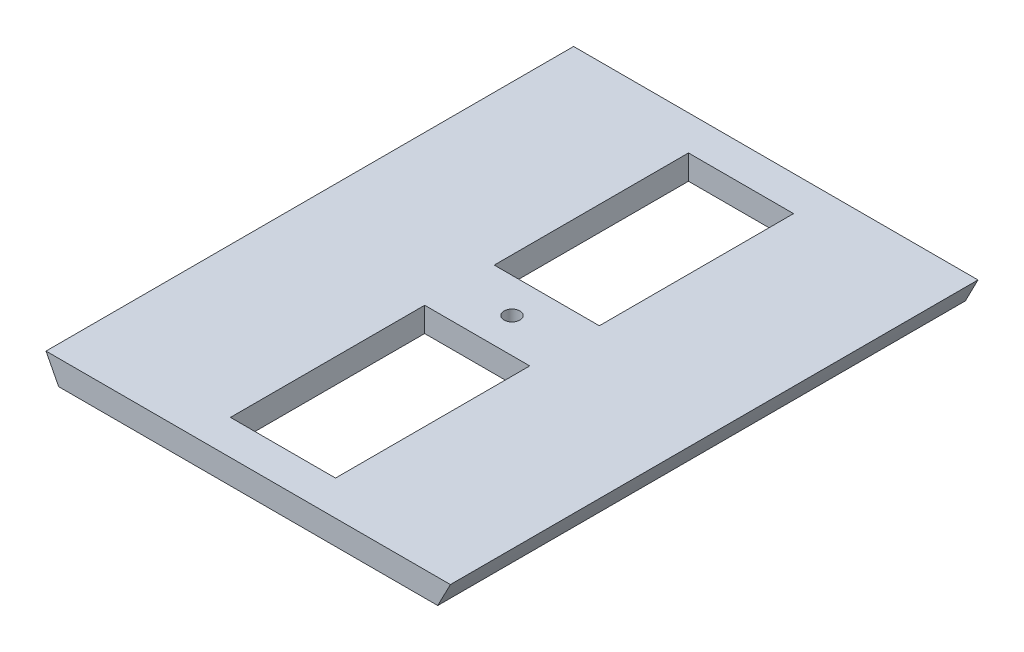
ISO-10303-21;
HEADER;
FILE_DESCRIPTION(('STEP AP214'),'2;1');
FILE_NAME('part.step','',(''),(''),'','','');
FILE_SCHEMA(('AUTOMOTIVE_DESIGN { 1 0 10303 214 1 1 1 1 }'));
ENDSEC;
DATA;
#1=APPLICATION_CONTEXT('core data for automotive mechanical design processes');
#2=APPLICATION_PROTOCOL_DEFINITION('international standard','automotive_design',2000,#1);
#3=PRODUCT_CONTEXT('',#1,'mechanical');
#4=PRODUCT('Part','Part','',(#3));
#5=PRODUCT_RELATED_PRODUCT_CATEGORY('part','',(#4));
#6=PRODUCT_DEFINITION_FORMATION('','',#4);
#7=PRODUCT_DEFINITION_CONTEXT('part definition',#1,'design');
#8=PRODUCT_DEFINITION('design','',#6,#7);
#9=PRODUCT_DEFINITION_SHAPE('','',#8);
#10=(LENGTH_UNIT() NAMED_UNIT(*) SI_UNIT(.MILLI.,.METRE.));
#11=(NAMED_UNIT(*) PLANE_ANGLE_UNIT() SI_UNIT($,.RADIAN.));
#12=(NAMED_UNIT(*) SI_UNIT($,.STERADIAN.) SOLID_ANGLE_UNIT());
#13=UNCERTAINTY_MEASURE_WITH_UNIT(LENGTH_MEASURE(1.E-05),#10,'distance_accuracy_value','');
#14=(GEOMETRIC_REPRESENTATION_CONTEXT(3) GLOBAL_UNCERTAINTY_ASSIGNED_CONTEXT((#13)) GLOBAL_UNIT_ASSIGNED_CONTEXT((#10,
#11,#12)) REPRESENTATION_CONTEXT('',''));
#15=CARTESIAN_POINT('',(0.,0.,0.));
#16=DIRECTION('',(0.,0.,1.));
#17=DIRECTION('',(1.,0.,0.));
#18=AXIS2_PLACEMENT_3D('',#15,#16,#17);
#19=CARTESIAN_POINT('',(-127.000000000214,127.000000000428,331.382));
#20=CARTESIAN_POINT('',(-3.79340656109228E-11,-127.000000000353,331.382));
#21=CARTESIAN_POINT('',(127.000000000138,127.000000000277,331.382));
#22=B_SPLINE_CURVE_WITH_KNOTS('',2,(#19,#20,#21),.UNSPECIFIED.,.F.,.F.,(3,3),
(0.0560283962320779,0.943971603767657),.UNSPECIFIED.);
#23=DIRECTION('',(0.,0.,-1.));
#24=VECTOR('',#23,1.);
#25=SURFACE_OF_LINEAR_EXTRUSION('',#22,#24);
#26=CARTESIAN_POINT('',(-127.000000000214,127.000000000428,0.));
#27=CARTESIAN_POINT('',(-3.79340656109228E-11,-127.000000000353,0.));
#28=CARTESIAN_POINT('',(127.000000000138,127.000000000277,0.));
#29=B_SPLINE_CURVE_WITH_KNOTS('',2,(#26,#27,#28),.UNSPECIFIED.,.F.,.F.,(3,3),
(0.0560283962320779,0.943971603767657),.UNSPECIFIED.);
#30=CARTESIAN_POINT('',(-127.000000000171,127.000000000343,0.));
#31=VERTEX_POINT('',#30);
#32=CARTESIAN_POINT('',(-119.051249468448,111.599999999989,0.));
#33=VERTEX_POINT('',#32);
#34=EDGE_CURVE('E141',#31,#33,#29,.T.);
#35=ORIENTED_EDGE('',*,*,#34,.T.);
#36=DIRECTION('',(0.,0.,-1.));
#37=VECTOR('',#36,1.);
#38=CARTESIAN_POINT('',(-119.051249468454,111.6,331.382));
#39=LINE('',#38,#37);
#40=CARTESIAN_POINT('',(-119.051249468448,111.6,331.382));
#41=VERTEX_POINT('',#40);
#42=EDGE_CURVE('E50',#33,#41,#39,.F.);
#43=ORIENTED_EDGE('',*,*,#42,.T.);
#44=CARTESIAN_POINT('',(-127.000000000171,127.000000000343,331.382));
#45=VERTEX_POINT('',#44);
#46=EDGE_CURVE('E159',#45,#41,#22,.T.);
#47=ORIENTED_EDGE('',*,*,#46,.F.);
#48=DIRECTION('',(0.,0.,-1.));
#49=VECTOR('',#48,1.);
#50=CARTESIAN_POINT('',(-127.000000000171,127.000000000343,331.382));
#51=LINE('',#50,#49);
#52=EDGE_CURVE('E43',#45,#31,#51,.T.);
#53=ORIENTED_EDGE('',*,*,#52,.T.);
#54=EDGE_LOOP('',(#35,#43,#47,#53));
#55=FACE_BOUND('',#54,.T.);
#56=ADVANCED_FACE('F33',(#55),#25,.F.);
#57=CARTESIAN_POINT('',(119.051249468448,111.6,331.382));
#58=VERTEX_POINT('',#57);
#59=CARTESIAN_POINT('',(127.000000000094,127.000000000343,331.382));
#60=VERTEX_POINT('',#59);
#61=EDGE_CURVE('E137',#58,#60,#22,.T.);
#62=ORIENTED_EDGE('',*,*,#61,.F.);
#63=DIRECTION('',(0.,0.,-1.));
#64=VECTOR('',#63,1.);
#65=CARTESIAN_POINT('',(119.051249468454,111.6,331.382));
#66=LINE('',#65,#64);
#67=CARTESIAN_POINT('',(119.051249468448,111.6,0.));
#68=VERTEX_POINT('',#67);
#69=EDGE_CURVE('E124',#58,#68,#66,.T.);
#70=ORIENTED_EDGE('',*,*,#69,.T.);
#71=CARTESIAN_POINT('',(127.000000000094,127.000000000343,0.));
#72=VERTEX_POINT('',#71);
#73=EDGE_CURVE('E135',#68,#72,#29,.T.);
#74=ORIENTED_EDGE('',*,*,#73,.T.);
#75=DIRECTION('',(0.,0.,-1.));
#76=VECTOR('',#75,1.);
#77=CARTESIAN_POINT('',(127.000000000094,127.000000000343,331.382));
#78=LINE('',#77,#76);
#79=EDGE_CURVE('E11',#60,#72,#78,.T.);
#80=ORIENTED_EDGE('',*,*,#79,.F.);
#81=EDGE_LOOP('',(#62,#70,#74,#80));
#82=FACE_BOUND('',#81,.T.);
#83=ADVANCED_FACE('F35',(#82),#25,.F.);
#84=CARTESIAN_POINT('',(-127.000000000171,127.000000000343,331.382));
#85=DIRECTION('',(0.,-1.,0.));
#86=DIRECTION('',(0.,0.,-1.));
#87=AXIS2_PLACEMENT_3D('',#84,#85,#86);
#88=PLANE('',#87);
#89=CARTESIAN_POINT('',(-3.86635168325711E-11,127.000000000343,165.691));
#90=DIRECTION('',(0.,1.,0.));
#91=DIRECTION('',(0.,0.,1.));
#92=AXIS2_PLACEMENT_3D('',#89,#90,#91);
#93=CIRCLE('',#92,5.);
#94=CARTESIAN_POINT('',(-3.86635168325711E-11,127.000000000343,170.691));
#95=VERTEX_POINT('',#94);
#96=EDGE_CURVE('E207',#95,#95,#93,.T.);
#97=ORIENTED_EDGE('',*,*,#96,.F.);
#98=EDGE_LOOP('',(#97));
#99=FACE_BOUND('',#98,.T.);
#100=DIRECTION('',(1.,0.,0.));
#101=VECTOR('',#100,1.);
#102=CARTESIAN_POINT('',(-33.,127.000000000343,309.5365));
#103=LINE('',#102,#101);
#104=CARTESIAN_POINT('',(-33.,127.000000000343,309.5365));
#105=VERTEX_POINT('',#104);
#106=CARTESIAN_POINT('',(33.,127.000000000343,309.5365));
#107=VERTEX_POINT('',#106);
#108=EDGE_CURVE('E201',#105,#107,#103,.T.);
#109=ORIENTED_EDGE('',*,*,#108,.F.);
#110=DIRECTION('',(0.,0.,1.));
#111=VECTOR('',#110,1.);
#112=CARTESIAN_POINT('',(-33.,127.000000000343,187.5365));
#113=LINE('',#112,#111);
#114=CARTESIAN_POINT('',(-33.,127.000000000343,187.5365));
#115=VERTEX_POINT('',#114);
#116=EDGE_CURVE('E204',#115,#105,#113,.T.);
#117=ORIENTED_EDGE('',*,*,#116,.F.);
#118=DIRECTION('',(-1.,0.,0.));
#119=VECTOR('',#118,1.);
#120=CARTESIAN_POINT('',(-33.,127.000000000343,187.5365));
#121=LINE('',#120,#119);
#122=CARTESIAN_POINT('',(33.,127.000000000343,187.5365));
#123=VERTEX_POINT('',#122);
#124=EDGE_CURVE('E191',#123,#115,#121,.T.);
#125=ORIENTED_EDGE('',*,*,#124,.F.);
#126=DIRECTION('',(0.,0.,-1.));
#127=VECTOR('',#126,1.);
#128=CARTESIAN_POINT('',(33.,127.000000000343,187.5365));
#129=LINE('',#128,#127);
#130=EDGE_CURVE('E198',#107,#123,#129,.T.);
#131=ORIENTED_EDGE('',*,*,#130,.F.);
#132=EDGE_LOOP('',(#109,#117,#125,#131));
#133=FACE_BOUND('',#132,.T.);
#134=DIRECTION('',(1.,0.,0.));
#135=VECTOR('',#134,1.);
#136=CARTESIAN_POINT('',(-33.,127.000000000343,143.8455));
#137=LINE('',#136,#135);
#138=CARTESIAN_POINT('',(-33.,127.000000000343,143.8455));
#139=VERTEX_POINT('',#138);
#140=CARTESIAN_POINT('',(33.,127.000000000343,143.8455));
#141=VERTEX_POINT('',#140);
#142=EDGE_CURVE('E181',#139,#141,#137,.T.);
#143=ORIENTED_EDGE('',*,*,#142,.F.);
#144=DIRECTION('',(0.,0.,1.));
#145=VECTOR('',#144,1.);
#146=CARTESIAN_POINT('',(-33.,127.000000000343,21.8455));
#147=LINE('',#146,#145);
#148=CARTESIAN_POINT('',(-33.,127.000000000343,21.8455));
#149=VERTEX_POINT('',#148);
#150=EDGE_CURVE('E184',#149,#139,#147,.T.);
#151=ORIENTED_EDGE('',*,*,#150,.F.);
#152=DIRECTION('',(-1.,0.,0.));
#153=VECTOR('',#152,1.);
#154=CARTESIAN_POINT('',(-33.,127.000000000343,21.8455));
#155=LINE('',#154,#153);
#156=CARTESIAN_POINT('',(33.,127.000000000343,21.8455));
#157=VERTEX_POINT('',#156);
#158=EDGE_CURVE('E173',#157,#149,#155,.T.);
#159=ORIENTED_EDGE('',*,*,#158,.F.);
#160=DIRECTION('',(0.,0.,-1.));
#161=VECTOR('',#160,1.);
#162=CARTESIAN_POINT('',(33.,127.000000000343,21.8455));
#163=LINE('',#162,#161);
#164=EDGE_CURVE('E178',#141,#157,#163,.T.);
#165=ORIENTED_EDGE('',*,*,#164,.F.);
#166=EDGE_LOOP('',(#143,#151,#159,#165));
#167=FACE_BOUND('',#166,.T.);
#168=DIRECTION('',(-1.,0.,0.));
#169=VECTOR('',#168,1.);
#170=CARTESIAN_POINT('',(-127.000000000171,127.000000000343,0.));
#171=LINE('',#170,#169);
#172=EDGE_CURVE('E140',#72,#31,#171,.T.);
#173=ORIENTED_EDGE('',*,*,#172,.T.);
#174=ORIENTED_EDGE('',*,*,#52,.F.);
#175=DIRECTION('',(-1.,0.,0.));
#176=VECTOR('',#175,1.);
#177=CARTESIAN_POINT('',(-127.000000000171,127.000000000343,331.382));
#178=LINE('',#177,#176);
#179=EDGE_CURVE('E150',#60,#45,#178,.T.);
#180=ORIENTED_EDGE('',*,*,#179,.F.);
#181=ORIENTED_EDGE('',*,*,#79,.T.);
#182=EDGE_LOOP('',(#173,#174,#180,#181));
#183=FACE_BOUND('',#182,.T.);
#184=ADVANCED_FACE('F253',(#99,#133,#167,#183),#88,.F.);
#185=CARTESIAN_POINT('',(-3.79349329726608E-11,0.,331.382));
#186=DIRECTION('',(0.,0.,-1.));
#187=DIRECTION('',(-1.,0.,0.));
#188=AXIS2_PLACEMENT_3D('',#185,#186,#187);
#189=PLANE('',#188);
#190=ORIENTED_EDGE('',*,*,#46,.T.);
#191=DIRECTION('',(1.,0.,0.));
#192=VECTOR('',#191,1.);
#193=CARTESIAN_POINT('',(120.,111.6,331.382));
#194=LINE('',#193,#192);
#195=EDGE_CURVE('E130',#41,#58,#194,.T.);
#196=ORIENTED_EDGE('',*,*,#195,.T.);
#197=ORIENTED_EDGE('',*,*,#61,.T.);
#198=ORIENTED_EDGE('',*,*,#179,.T.);
#199=EDGE_LOOP('',(#190,#196,#197,#198));
#200=FACE_BOUND('',#199,.T.);
#201=ADVANCED_FACE('F267',(#200),#189,.F.);
#202=CARTESIAN_POINT('',(-3.79349329726608E-11,0.,0.));
#203=DIRECTION('',(0.,0.,-1.));
#204=DIRECTION('',(-1.,0.,0.));
#205=AXIS2_PLACEMENT_3D('',#202,#203,#204);
#206=PLANE('',#205);
#207=DIRECTION('',(1.,0.,0.));
#208=VECTOR('',#207,1.);
#209=CARTESIAN_POINT('',(120.,111.6,0.));
#210=LINE('',#209,#208);
#211=EDGE_CURVE('E121',#33,#68,#210,.T.);
#212=ORIENTED_EDGE('',*,*,#211,.F.);
#213=ORIENTED_EDGE('',*,*,#34,.F.);
#214=ORIENTED_EDGE('',*,*,#172,.F.);
#215=ORIENTED_EDGE('',*,*,#73,.F.);
#216=EDGE_LOOP('',(#212,#213,#214,#215));
#217=FACE_BOUND('',#216,.T.);
#218=ADVANCED_FACE('F139',(#217),#206,.T.);
#219=CARTESIAN_POINT('',(-33.,-3.79141162909491E-11,21.8455));
#220=DIRECTION('',(-1.,0.,0.));
#221=DIRECTION('',(0.,0.,1.));
#222=AXIS2_PLACEMENT_3D('',#219,#220,#221);
#223=PLANE('',#222);
#224=DIRECTION('',(0.,1.,0.));
#225=VECTOR('',#224,1.);
#226=CARTESIAN_POINT('',(-33.,-3.79141162909491E-11,143.8455));
#227=LINE('',#226,#225);
#228=CARTESIAN_POINT('',(-33.,111.6,143.8455));
#229=VERTEX_POINT('',#228);
#230=EDGE_CURVE('E167',#229,#139,#227,.T.);
#231=ORIENTED_EDGE('',*,*,#230,.F.);
#232=DIRECTION('',(0.,0.,-1.));
#233=VECTOR('',#232,1.);
#234=CARTESIAN_POINT('',(-33.,111.6,21.8455));
#235=LINE('',#234,#233);
#236=CARTESIAN_POINT('',(-33.,111.6,21.8455));
#237=VERTEX_POINT('',#236);
#238=EDGE_CURVE('E58',#229,#237,#235,.T.);
#239=ORIENTED_EDGE('',*,*,#238,.T.);
#240=DIRECTION('',(0.,1.,0.));
#241=VECTOR('',#240,1.);
#242=CARTESIAN_POINT('',(-33.,-3.79141162909491E-11,21.8455));
#243=LINE('',#242,#241);
#244=EDGE_CURVE('E142',#237,#149,#243,.T.);
#245=ORIENTED_EDGE('',*,*,#244,.T.);
#246=ORIENTED_EDGE('',*,*,#150,.T.);
#247=EDGE_LOOP('',(#231,#239,#245,#246));
#248=FACE_BOUND('',#247,.T.);
#249=ADVANCED_FACE('F259',(#248),#223,.F.);
#250=CARTESIAN_POINT('',(-33.,-3.79141162909491E-11,21.8455));
#251=DIRECTION('',(0.,0.,-1.));
#252=DIRECTION('',(-1.,0.,0.));
#253=AXIS2_PLACEMENT_3D('',#250,#251,#252);
#254=PLANE('',#253);
#255=ORIENTED_EDGE('',*,*,#244,.F.);
#256=DIRECTION('',(1.,0.,0.));
#257=VECTOR('',#256,1.);
#258=CARTESIAN_POINT('',(-33.,111.6,21.8455));
#259=LINE('',#258,#257);
#260=CARTESIAN_POINT('',(33.,111.6,21.8455));
#261=VERTEX_POINT('',#260);
#262=EDGE_CURVE('E212',#237,#261,#259,.T.);
#263=ORIENTED_EDGE('',*,*,#262,.T.);
#264=DIRECTION('',(0.,1.,0.));
#265=VECTOR('',#264,1.);
#266=CARTESIAN_POINT('',(33.,-3.79141162909491E-11,21.8455));
#267=LINE('',#266,#265);
#268=EDGE_CURVE('E144',#261,#157,#267,.T.);
#269=ORIENTED_EDGE('',*,*,#268,.T.);
#270=ORIENTED_EDGE('',*,*,#158,.T.);
#271=EDGE_LOOP('',(#255,#263,#269,#270));
#272=FACE_BOUND('',#271,.T.);
#273=ADVANCED_FACE('F257',(#272),#254,.F.);
#274=CARTESIAN_POINT('',(33.,-3.79141162909491E-11,21.8455));
#275=DIRECTION('',(1.,0.,0.));
#276=DIRECTION('',(0.,0.,-1.));
#277=AXIS2_PLACEMENT_3D('',#274,#275,#276);
#278=PLANE('',#277);
#279=ORIENTED_EDGE('',*,*,#268,.F.);
#280=DIRECTION('',(0.,0.,1.));
#281=VECTOR('',#280,1.);
#282=CARTESIAN_POINT('',(33.,111.6,21.8455));
#283=LINE('',#282,#281);
#284=CARTESIAN_POINT('',(33.0000000000001,111.6,143.8455));
#285=VERTEX_POINT('',#284);
#286=EDGE_CURVE('E215',#261,#285,#283,.T.);
#287=ORIENTED_EDGE('',*,*,#286,.T.);
#288=DIRECTION('',(0.,1.,0.));
#289=VECTOR('',#288,1.);
#290=CARTESIAN_POINT('',(33.,-3.79141162909491E-11,143.8455));
#291=LINE('',#290,#289);
#292=EDGE_CURVE('E172',#285,#141,#291,.T.);
#293=ORIENTED_EDGE('',*,*,#292,.T.);
#294=ORIENTED_EDGE('',*,*,#164,.T.);
#295=EDGE_LOOP('',(#279,#287,#293,#294));
#296=FACE_BOUND('',#295,.T.);
#297=ADVANCED_FACE('F246',(#296),#278,.F.);
#298=CARTESIAN_POINT('',(-33.,-3.79141162909491E-11,143.8455));
#299=DIRECTION('',(0.,0.,1.));
#300=DIRECTION('',(1.,0.,0.));
#301=AXIS2_PLACEMENT_3D('',#298,#299,#300);
#302=PLANE('',#301);
#303=ORIENTED_EDGE('',*,*,#292,.F.);
#304=DIRECTION('',(-1.,0.,0.));
#305=VECTOR('',#304,1.);
#306=CARTESIAN_POINT('',(-33.,111.6,143.8455));
#307=LINE('',#306,#305);
#308=EDGE_CURVE('E218',#285,#229,#307,.T.);
#309=ORIENTED_EDGE('',*,*,#308,.T.);
#310=ORIENTED_EDGE('',*,*,#230,.T.);
#311=ORIENTED_EDGE('',*,*,#142,.T.);
#312=EDGE_LOOP('',(#303,#309,#310,#311));
#313=FACE_BOUND('',#312,.T.);
#314=ADVANCED_FACE('F247',(#313),#302,.F.);
#315=CARTESIAN_POINT('',(-33.,-3.79141162909491E-11,187.5365));
#316=DIRECTION('',(-1.,0.,0.));
#317=DIRECTION('',(0.,0.,1.));
#318=AXIS2_PLACEMENT_3D('',#315,#316,#317);
#319=PLANE('',#318);
#320=DIRECTION('',(0.,1.,0.));
#321=VECTOR('',#320,1.);
#322=CARTESIAN_POINT('',(-33.,-3.79141162909491E-11,309.5365));
#323=LINE('',#322,#321);
#324=CARTESIAN_POINT('',(-33.,111.6,309.5365));
#325=VERTEX_POINT('',#324);
#326=EDGE_CURVE('E188',#325,#105,#323,.T.);
#327=ORIENTED_EDGE('',*,*,#326,.F.);
#328=DIRECTION('',(0.,0.,-1.));
#329=VECTOR('',#328,1.);
#330=CARTESIAN_POINT('',(-33.,111.6,187.5365));
#331=LINE('',#330,#329);
#332=CARTESIAN_POINT('',(-33.,111.6,187.5365));
#333=VERTEX_POINT('',#332);
#334=EDGE_CURVE('E220',#325,#333,#331,.T.);
#335=ORIENTED_EDGE('',*,*,#334,.T.);
#336=DIRECTION('',(0.,1.,0.));
#337=VECTOR('',#336,1.);
#338=CARTESIAN_POINT('',(-33.,-3.79141162909491E-11,187.5365));
#339=LINE('',#338,#337);
#340=EDGE_CURVE('E187',#333,#115,#339,.T.);
#341=ORIENTED_EDGE('',*,*,#340,.T.);
#342=ORIENTED_EDGE('',*,*,#116,.T.);
#343=EDGE_LOOP('',(#327,#335,#341,#342));
#344=FACE_BOUND('',#343,.T.);
#345=ADVANCED_FACE('F293',(#344),#319,.F.);
#346=CARTESIAN_POINT('',(-33.,-3.79141162909491E-11,187.5365));
#347=DIRECTION('',(0.,0.,-1.));
#348=DIRECTION('',(-1.,0.,0.));
#349=AXIS2_PLACEMENT_3D('',#346,#347,#348);
#350=PLANE('',#349);
#351=ORIENTED_EDGE('',*,*,#340,.F.);
#352=DIRECTION('',(1.,0.,0.));
#353=VECTOR('',#352,1.);
#354=CARTESIAN_POINT('',(-33.,111.6,187.5365));
#355=LINE('',#354,#353);
#356=CARTESIAN_POINT('',(33.,111.6,187.5365));
#357=VERTEX_POINT('',#356);
#358=EDGE_CURVE('E223',#333,#357,#355,.T.);
#359=ORIENTED_EDGE('',*,*,#358,.T.);
#360=DIRECTION('',(0.,1.,0.));
#361=VECTOR('',#360,1.);
#362=CARTESIAN_POINT('',(33.,-3.79141162909491E-11,187.5365));
#363=LINE('',#362,#361);
#364=EDGE_CURVE('E193',#357,#123,#363,.T.);
#365=ORIENTED_EDGE('',*,*,#364,.T.);
#366=ORIENTED_EDGE('',*,*,#124,.T.);
#367=EDGE_LOOP('',(#351,#359,#365,#366));
#368=FACE_BOUND('',#367,.T.);
#369=ADVANCED_FACE('F296',(#368),#350,.F.);
#370=CARTESIAN_POINT('',(33.,-3.79141162909491E-11,187.5365));
#371=DIRECTION('',(1.,0.,0.));
#372=DIRECTION('',(0.,0.,-1.));
#373=AXIS2_PLACEMENT_3D('',#370,#371,#372);
#374=PLANE('',#373);
#375=ORIENTED_EDGE('',*,*,#364,.F.);
#376=DIRECTION('',(0.,0.,1.));
#377=VECTOR('',#376,1.);
#378=CARTESIAN_POINT('',(33.,111.6,187.5365));
#379=LINE('',#378,#377);
#380=CARTESIAN_POINT('',(33.0000000000001,111.6,309.5365));
#381=VERTEX_POINT('',#380);
#382=EDGE_CURVE('E226',#357,#381,#379,.T.);
#383=ORIENTED_EDGE('',*,*,#382,.T.);
#384=DIRECTION('',(0.,1.,0.));
#385=VECTOR('',#384,1.);
#386=CARTESIAN_POINT('',(33.,-3.79141162909491E-11,309.5365));
#387=LINE('',#386,#385);
#388=EDGE_CURVE('E190',#381,#107,#387,.T.);
#389=ORIENTED_EDGE('',*,*,#388,.T.);
#390=ORIENTED_EDGE('',*,*,#130,.T.);
#391=EDGE_LOOP('',(#375,#383,#389,#390));
#392=FACE_BOUND('',#391,.T.);
#393=ADVANCED_FACE('F299',(#392),#374,.F.);
#394=CARTESIAN_POINT('',(-33.,-3.79141162909491E-11,309.5365));
#395=DIRECTION('',(0.,0.,1.));
#396=DIRECTION('',(1.,0.,0.));
#397=AXIS2_PLACEMENT_3D('',#394,#395,#396);
#398=PLANE('',#397);
#399=ORIENTED_EDGE('',*,*,#388,.F.);
#400=DIRECTION('',(-1.,0.,0.));
#401=VECTOR('',#400,1.);
#402=CARTESIAN_POINT('',(-33.,111.6,309.5365));
#403=LINE('',#402,#401);
#404=EDGE_CURVE('E229',#381,#325,#403,.T.);
#405=ORIENTED_EDGE('',*,*,#404,.T.);
#406=ORIENTED_EDGE('',*,*,#326,.T.);
#407=ORIENTED_EDGE('',*,*,#108,.T.);
#408=EDGE_LOOP('',(#399,#405,#406,#407));
#409=FACE_BOUND('',#408,.T.);
#410=ADVANCED_FACE('F290',(#409),#398,.F.);
#411=CARTESIAN_POINT('',(-3.86635168325711E-11,-3.79141162909491E-11,165.691));
#412=DIRECTION('',(0.,1.,0.));
#413=DIRECTION('',(0.,0.,1.));
#414=AXIS2_PLACEMENT_3D('',#411,#412,#413);
#415=CYLINDRICAL_SURFACE('',#414,5.);
#416=CARTESIAN_POINT('',(-3.86635168325711E-11,111.6,165.691));
#417=DIRECTION('',(0.,1.,0.));
#418=DIRECTION('',(0.,0.,1.));
#419=AXIS2_PLACEMENT_3D('',#416,#417,#418);
#420=CIRCLE('',#419,5.);
#421=CARTESIAN_POINT('',(-3.86635168325711E-11,111.6,170.691));
#422=VERTEX_POINT('',#421);
#423=EDGE_CURVE('E38',#422,#422,#420,.F.);
#424=ORIENTED_EDGE('',*,*,#423,.T.);
#425=EDGE_LOOP('',(#424));
#426=FACE_BOUND('',#425,.T.);
#427=ORIENTED_EDGE('',*,*,#96,.T.);
#428=EDGE_LOOP('',(#427));
#429=FACE_BOUND('',#428,.T.);
#430=ADVANCED_FACE('F235',(#426,#429),#415,.F.);
#431=CARTESIAN_POINT('',(120.,111.6,331.382));
#432=DIRECTION('',(0.,1.,0.));
#433=DIRECTION('',(0.,0.,1.));
#434=AXIS2_PLACEMENT_3D('',#431,#432,#433);
#435=PLANE('',#434);
#436=ORIENTED_EDGE('',*,*,#423,.F.);
#437=EDGE_LOOP('',(#436));
#438=FACE_BOUND('',#437,.T.);
#439=ORIENTED_EDGE('',*,*,#404,.F.);
#440=ORIENTED_EDGE('',*,*,#382,.F.);
#441=ORIENTED_EDGE('',*,*,#358,.F.);
#442=ORIENTED_EDGE('',*,*,#334,.F.);
#443=EDGE_LOOP('',(#439,#440,#441,#442));
#444=FACE_BOUND('',#443,.T.);
#445=ORIENTED_EDGE('',*,*,#308,.F.);
#446=ORIENTED_EDGE('',*,*,#286,.F.);
#447=ORIENTED_EDGE('',*,*,#262,.F.);
#448=ORIENTED_EDGE('',*,*,#238,.F.);
#449=EDGE_LOOP('',(#445,#446,#447,#448));
#450=FACE_BOUND('',#449,.T.);
#451=ORIENTED_EDGE('',*,*,#211,.T.);
#452=ORIENTED_EDGE('',*,*,#69,.F.);
#453=ORIENTED_EDGE('',*,*,#195,.F.);
#454=ORIENTED_EDGE('',*,*,#42,.F.);
#455=EDGE_LOOP('',(#451,#452,#453,#454));
#456=FACE_BOUND('',#455,.T.);
#457=ADVANCED_FACE('F123',(#438,#444,#450,#456),#435,.F.);
#458=CLOSED_SHELL('',(#56,#83,#184,#201,#218,#249,#273,#297,#314,#345,#369,#393,#410,#430,#457));
#459=MANIFOLD_SOLID_BREP('B2',#458);
#460=ADVANCED_BREP_SHAPE_REPRESENTATION('',(#18,#459),#14);
#461=SHAPE_DEFINITION_REPRESENTATION(#9,#460);
ENDSEC;
END-ISO-10303-21;
